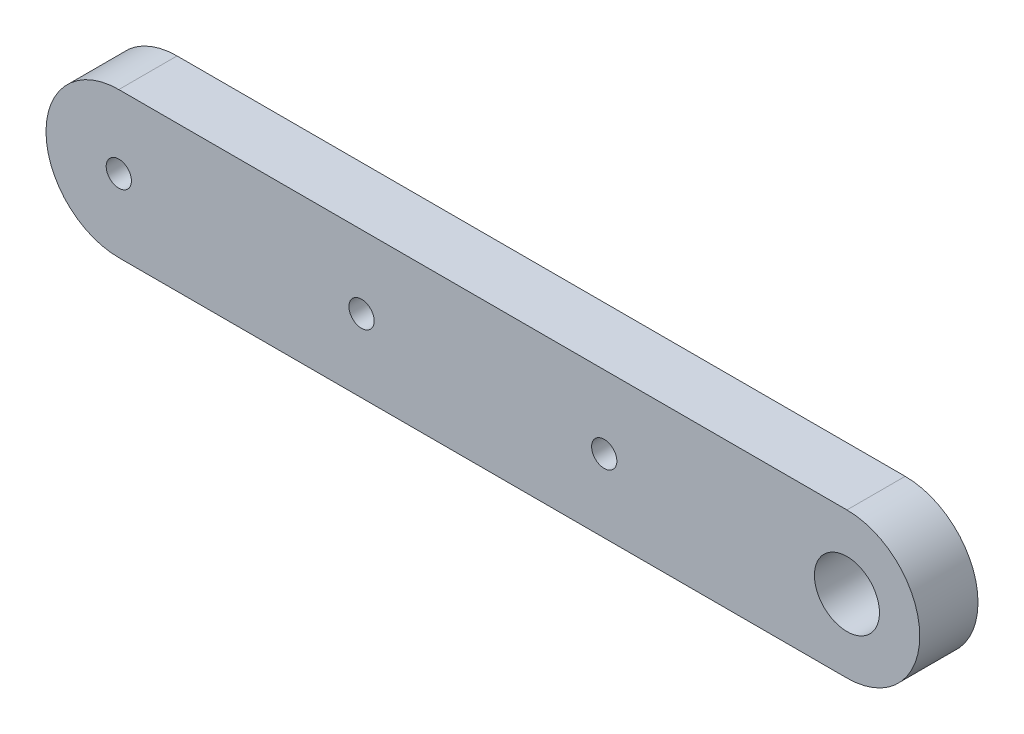
ISO-10303-21;
HEADER;
FILE_DESCRIPTION(('STEP AP214'),'2;1');
FILE_NAME('part.step','',(''),(''),'','','');
FILE_SCHEMA(('AUTOMOTIVE_DESIGN { 1 0 10303 214 1 1 1 1 }'));
ENDSEC;
DATA;
#1=APPLICATION_CONTEXT('core data for automotive mechanical design processes');
#2=APPLICATION_PROTOCOL_DEFINITION('international standard','automotive_design',2000,#1);
#3=PRODUCT_CONTEXT('',#1,'mechanical');
#4=PRODUCT('Part','Part','',(#3));
#5=PRODUCT_RELATED_PRODUCT_CATEGORY('part','',(#4));
#6=PRODUCT_DEFINITION_FORMATION('','',#4);
#7=PRODUCT_DEFINITION_CONTEXT('part definition',#1,'design');
#8=PRODUCT_DEFINITION('design','',#6,#7);
#9=PRODUCT_DEFINITION_SHAPE('','',#8);
#10=(LENGTH_UNIT() NAMED_UNIT(*) SI_UNIT(.MILLI.,.METRE.));
#11=(NAMED_UNIT(*) PLANE_ANGLE_UNIT() SI_UNIT($,.RADIAN.));
#12=(NAMED_UNIT(*) SI_UNIT($,.STERADIAN.) SOLID_ANGLE_UNIT());
#13=UNCERTAINTY_MEASURE_WITH_UNIT(LENGTH_MEASURE(1.E-05),#10,'distance_accuracy_value','');
#14=(GEOMETRIC_REPRESENTATION_CONTEXT(3) GLOBAL_UNCERTAINTY_ASSIGNED_CONTEXT((#13)) GLOBAL_UNIT_ASSIGNED_CONTEXT((#10,
#11,#12)) REPRESENTATION_CONTEXT('',''));
#15=CARTESIAN_POINT('',(0.,0.,0.));
#16=DIRECTION('',(0.,0.,1.));
#17=DIRECTION('',(1.,0.,0.));
#18=AXIS2_PLACEMENT_3D('',#15,#16,#17);
#19=CARTESIAN_POINT('',(0.,-7.5,6.));
#20=DIRECTION('',(0.,-1.,0.));
#21=DIRECTION('',(0.,0.,-1.));
#22=AXIS2_PLACEMENT_3D('',#19,#20,#21);
#23=PLANE('',#22);
#24=DIRECTION('',(-1.,0.,0.));
#25=VECTOR('',#24,1.);
#26=CARTESIAN_POINT('',(0.,-7.5,0.));
#27=LINE('',#26,#25);
#28=CARTESIAN_POINT('',(75.,-7.50000000000001,0.));
#29=VERTEX_POINT('',#28);
#30=CARTESIAN_POINT('',(0.,-7.5,0.));
#31=VERTEX_POINT('',#30);
#32=EDGE_CURVE('E111',#29,#31,#27,.T.);
#33=ORIENTED_EDGE('',*,*,#32,.F.);
#34=DIRECTION('',(0.,0.,-1.));
#35=VECTOR('',#34,1.);
#36=CARTESIAN_POINT('',(75.,-7.50000000000001,6.));
#37=LINE('',#36,#35);
#38=CARTESIAN_POINT('',(75.,-7.50000000000001,6.));
#39=VERTEX_POINT('',#38);
#40=EDGE_CURVE('E11',#39,#29,#37,.T.);
#41=ORIENTED_EDGE('',*,*,#40,.F.);
#42=DIRECTION('',(-1.,0.,0.));
#43=VECTOR('',#42,1.);
#44=CARTESIAN_POINT('',(0.,-7.5,6.));
#45=LINE('',#44,#43);
#46=CARTESIAN_POINT('',(0.,-7.5,6.));
#47=VERTEX_POINT('',#46);
#48=EDGE_CURVE('E92',#39,#47,#45,.T.);
#49=ORIENTED_EDGE('',*,*,#48,.T.);
#50=DIRECTION('',(0.,0.,-1.));
#51=VECTOR('',#50,1.);
#52=CARTESIAN_POINT('',(0.,-7.5,6.));
#53=LINE('',#52,#51);
#54=EDGE_CURVE('E82',#47,#31,#53,.T.);
#55=ORIENTED_EDGE('',*,*,#54,.T.);
#56=EDGE_LOOP('',(#33,#41,#49,#55));
#57=FACE_BOUND('',#56,.T.);
#58=ADVANCED_FACE('F43',(#57),#23,.T.);
#59=CARTESIAN_POINT('',(75.,0.,6.));
#60=DIRECTION('',(0.,0.,-1.));
#61=DIRECTION('',(-1.,0.,0.));
#62=AXIS2_PLACEMENT_3D('',#59,#60,#61);
#63=CYLINDRICAL_SURFACE('',#62,7.50000000000001);
#64=CARTESIAN_POINT('',(75.,0.,0.));
#65=DIRECTION('',(0.,0.,1.));
#66=DIRECTION('',(1.,0.,0.));
#67=AXIS2_PLACEMENT_3D('',#64,#65,#66);
#68=CIRCLE('',#67,7.50000000000001);
#69=CARTESIAN_POINT('',(75.,7.50000000000001,0.));
#70=VERTEX_POINT('',#69);
#71=EDGE_CURVE('E99',#29,#70,#68,.T.);
#72=ORIENTED_EDGE('',*,*,#71,.T.);
#73=DIRECTION('',(0.,0.,-1.));
#74=VECTOR('',#73,1.);
#75=CARTESIAN_POINT('',(75.,7.50000000000001,6.));
#76=LINE('',#75,#74);
#77=CARTESIAN_POINT('',(75.,7.50000000000001,6.));
#78=VERTEX_POINT('',#77);
#79=EDGE_CURVE('E52',#78,#70,#76,.T.);
#80=ORIENTED_EDGE('',*,*,#79,.F.);
#81=CARTESIAN_POINT('',(75.,0.,6.));
#82=DIRECTION('',(0.,0.,1.));
#83=DIRECTION('',(1.,0.,0.));
#84=AXIS2_PLACEMENT_3D('',#81,#82,#83);
#85=CIRCLE('',#84,7.50000000000001);
#86=EDGE_CURVE('E87',#39,#78,#85,.T.);
#87=ORIENTED_EDGE('',*,*,#86,.F.);
#88=ORIENTED_EDGE('',*,*,#40,.T.);
#89=EDGE_LOOP('',(#72,#80,#87,#88));
#90=FACE_BOUND('',#89,.T.);
#91=ADVANCED_FACE('F97',(#90),#63,.T.);
#92=CARTESIAN_POINT('',(0.,7.5,6.));
#93=DIRECTION('',(0.,1.,0.));
#94=DIRECTION('',(0.,0.,1.));
#95=AXIS2_PLACEMENT_3D('',#92,#93,#94);
#96=PLANE('',#95);
#97=DIRECTION('',(1.,0.,0.));
#98=VECTOR('',#97,1.);
#99=CARTESIAN_POINT('',(0.,7.5,0.));
#100=LINE('',#99,#98);
#101=CARTESIAN_POINT('',(0.,7.5,0.));
#102=VERTEX_POINT('',#101);
#103=EDGE_CURVE('E118',#102,#70,#100,.T.);
#104=ORIENTED_EDGE('',*,*,#103,.F.);
#105=DIRECTION('',(0.,0.,-1.));
#106=VECTOR('',#105,1.);
#107=CARTESIAN_POINT('',(0.,7.5,6.));
#108=LINE('',#107,#106);
#109=CARTESIAN_POINT('',(0.,7.5,6.));
#110=VERTEX_POINT('',#109);
#111=EDGE_CURVE('E75',#110,#102,#108,.T.);
#112=ORIENTED_EDGE('',*,*,#111,.F.);
#113=DIRECTION('',(1.,0.,0.));
#114=VECTOR('',#113,1.);
#115=CARTESIAN_POINT('',(0.,7.5,6.));
#116=LINE('',#115,#114);
#117=EDGE_CURVE('E91',#110,#78,#116,.T.);
#118=ORIENTED_EDGE('',*,*,#117,.T.);
#119=ORIENTED_EDGE('',*,*,#79,.T.);
#120=EDGE_LOOP('',(#104,#112,#118,#119));
#121=FACE_BOUND('',#120,.T.);
#122=ADVANCED_FACE('F104',(#121),#96,.T.);
#123=CARTESIAN_POINT('',(0.,0.,6.));
#124=DIRECTION('',(0.,0.,-1.));
#125=DIRECTION('',(-1.,0.,0.));
#126=AXIS2_PLACEMENT_3D('',#123,#124,#125);
#127=CYLINDRICAL_SURFACE('',#126,7.5);
#128=CARTESIAN_POINT('',(0.,0.,0.));
#129=DIRECTION('',(0.,0.,1.));
#130=DIRECTION('',(1.,0.,0.));
#131=AXIS2_PLACEMENT_3D('',#128,#129,#130);
#132=CIRCLE('',#131,7.5);
#133=EDGE_CURVE('E121',#102,#31,#132,.T.);
#134=ORIENTED_EDGE('',*,*,#133,.T.);
#135=ORIENTED_EDGE('',*,*,#54,.F.);
#136=CARTESIAN_POINT('',(0.,0.,6.));
#137=DIRECTION('',(0.,0.,1.));
#138=DIRECTION('',(1.,0.,0.));
#139=AXIS2_PLACEMENT_3D('',#136,#137,#138);
#140=CIRCLE('',#139,7.5);
#141=EDGE_CURVE('E60',#110,#47,#140,.T.);
#142=ORIENTED_EDGE('',*,*,#141,.F.);
#143=ORIENTED_EDGE('',*,*,#111,.T.);
#144=EDGE_LOOP('',(#134,#135,#142,#143));
#145=FACE_BOUND('',#144,.T.);
#146=ADVANCED_FACE('F173',(#145),#127,.T.);
#147=CARTESIAN_POINT('',(0.,0.,6.));
#148=DIRECTION('',(0.,0.,1.));
#149=DIRECTION('',(1.,0.,0.));
#150=AXIS2_PLACEMENT_3D('',#147,#148,#149);
#151=PLANE('',#150);
#152=CARTESIAN_POINT('',(75.,0.,6.));
#153=DIRECTION('',(0.,0.,1.));
#154=DIRECTION('',(1.,0.,0.));
#155=AXIS2_PLACEMENT_3D('',#152,#153,#154);
#156=CIRCLE('',#155,3.35);
#157=CARTESIAN_POINT('',(78.35,0.,6.));
#158=VERTEX_POINT('',#157);
#159=EDGE_CURVE('E153',#158,#158,#156,.T.);
#160=ORIENTED_EDGE('',*,*,#159,.F.);
#161=EDGE_LOOP('',(#160));
#162=FACE_BOUND('',#161,.T.);
#163=CARTESIAN_POINT('',(25.,0.,6.));
#164=DIRECTION('',(0.,0.,1.));
#165=DIRECTION('',(1.,0.,0.));
#166=AXIS2_PLACEMENT_3D('',#163,#164,#165);
#167=CIRCLE('',#166,1.3);
#168=CARTESIAN_POINT('',(26.3,0.,6.));
#169=VERTEX_POINT('',#168);
#170=EDGE_CURVE('E146',#169,#169,#167,.T.);
#171=ORIENTED_EDGE('',*,*,#170,.F.);
#172=EDGE_LOOP('',(#171));
#173=FACE_BOUND('',#172,.T.);
#174=CARTESIAN_POINT('',(50.,0.,6.));
#175=DIRECTION('',(0.,0.,1.));
#176=DIRECTION('',(1.,0.,0.));
#177=AXIS2_PLACEMENT_3D('',#174,#175,#176);
#178=CIRCLE('',#177,1.3);
#179=CARTESIAN_POINT('',(51.3,0.,6.));
#180=VERTEX_POINT('',#179);
#181=EDGE_CURVE('E137',#180,#180,#178,.T.);
#182=ORIENTED_EDGE('',*,*,#181,.F.);
#183=EDGE_LOOP('',(#182));
#184=FACE_BOUND('',#183,.T.);
#185=CARTESIAN_POINT('',(0.,0.,6.));
#186=DIRECTION('',(0.,0.,1.));
#187=DIRECTION('',(1.,0.,0.));
#188=AXIS2_PLACEMENT_3D('',#185,#186,#187);
#189=CIRCLE('',#188,1.3);
#190=CARTESIAN_POINT('',(1.3,0.,6.));
#191=VERTEX_POINT('',#190);
#192=EDGE_CURVE('E129',#191,#191,#189,.T.);
#193=ORIENTED_EDGE('',*,*,#192,.F.);
#194=EDGE_LOOP('',(#193));
#195=FACE_BOUND('',#194,.T.);
#196=ORIENTED_EDGE('',*,*,#48,.F.);
#197=ORIENTED_EDGE('',*,*,#86,.T.);
#198=ORIENTED_EDGE('',*,*,#117,.F.);
#199=ORIENTED_EDGE('',*,*,#141,.T.);
#200=EDGE_LOOP('',(#196,#197,#198,#199));
#201=FACE_BOUND('',#200,.T.);
#202=ADVANCED_FACE('F89',(#162,#173,#184,#195,#201),#151,.T.);
#203=CARTESIAN_POINT('',(0.,0.,0.));
#204=DIRECTION('',(0.,0.,1.));
#205=DIRECTION('',(1.,0.,0.));
#206=AXIS2_PLACEMENT_3D('',#203,#204,#205);
#207=PLANE('',#206);
#208=CARTESIAN_POINT('',(75.,0.,0.));
#209=DIRECTION('',(0.,0.,1.));
#210=DIRECTION('',(1.,0.,0.));
#211=AXIS2_PLACEMENT_3D('',#208,#209,#210);
#212=CIRCLE('',#211,3.35);
#213=CARTESIAN_POINT('',(78.35,0.,0.));
#214=VERTEX_POINT('',#213);
#215=EDGE_CURVE('E142',#214,#214,#212,.T.);
#216=ORIENTED_EDGE('',*,*,#215,.T.);
#217=EDGE_LOOP('',(#216));
#218=FACE_BOUND('',#217,.T.);
#219=CARTESIAN_POINT('',(25.,0.,0.));
#220=DIRECTION('',(0.,0.,1.));
#221=DIRECTION('',(1.,0.,0.));
#222=AXIS2_PLACEMENT_3D('',#219,#220,#221);
#223=CIRCLE('',#222,1.3);
#224=CARTESIAN_POINT('',(26.3,0.,0.));
#225=VERTEX_POINT('',#224);
#226=EDGE_CURVE('E133',#225,#225,#223,.T.);
#227=ORIENTED_EDGE('',*,*,#226,.T.);
#228=EDGE_LOOP('',(#227));
#229=FACE_BOUND('',#228,.T.);
#230=CARTESIAN_POINT('',(50.,0.,0.));
#231=DIRECTION('',(0.,0.,1.));
#232=DIRECTION('',(1.,0.,0.));
#233=AXIS2_PLACEMENT_3D('',#230,#231,#232);
#234=CIRCLE('',#233,1.3);
#235=CARTESIAN_POINT('',(51.3,0.,0.));
#236=VERTEX_POINT('',#235);
#237=EDGE_CURVE('E141',#236,#236,#234,.T.);
#238=ORIENTED_EDGE('',*,*,#237,.T.);
#239=EDGE_LOOP('',(#238));
#240=FACE_BOUND('',#239,.T.);
#241=CARTESIAN_POINT('',(0.,0.,0.));
#242=DIRECTION('',(0.,0.,1.));
#243=DIRECTION('',(1.,0.,0.));
#244=AXIS2_PLACEMENT_3D('',#241,#242,#243);
#245=CIRCLE('',#244,1.3);
#246=CARTESIAN_POINT('',(1.3,0.,0.));
#247=VERTEX_POINT('',#246);
#248=EDGE_CURVE('E115',#247,#247,#245,.T.);
#249=ORIENTED_EDGE('',*,*,#248,.T.);
#250=EDGE_LOOP('',(#249));
#251=FACE_BOUND('',#250,.T.);
#252=ORIENTED_EDGE('',*,*,#32,.T.);
#253=ORIENTED_EDGE('',*,*,#133,.F.);
#254=ORIENTED_EDGE('',*,*,#103,.T.);
#255=ORIENTED_EDGE('',*,*,#71,.F.);
#256=EDGE_LOOP('',(#252,#253,#254,#255));
#257=FACE_BOUND('',#256,.T.);
#258=ADVANCED_FACE('F161',(#218,#229,#240,#251,#257),#207,.F.);
#259=CARTESIAN_POINT('',(0.,0.,0.));
#260=DIRECTION('',(0.,0.,1.));
#261=DIRECTION('',(1.,0.,0.));
#262=AXIS2_PLACEMENT_3D('',#259,#260,#261);
#263=CYLINDRICAL_SURFACE('',#262,1.3);
#264=ORIENTED_EDGE('',*,*,#248,.F.);
#265=EDGE_LOOP('',(#264));
#266=FACE_BOUND('',#265,.T.);
#267=ORIENTED_EDGE('',*,*,#192,.T.);
#268=EDGE_LOOP('',(#267));
#269=FACE_BOUND('',#268,.T.);
#270=ADVANCED_FACE('F181',(#266,#269),#263,.F.);
#271=CARTESIAN_POINT('',(50.,0.,0.));
#272=DIRECTION('',(0.,0.,1.));
#273=DIRECTION('',(1.,0.,0.));
#274=AXIS2_PLACEMENT_3D('',#271,#272,#273);
#275=CYLINDRICAL_SURFACE('',#274,1.3);
#276=ORIENTED_EDGE('',*,*,#237,.F.);
#277=EDGE_LOOP('',(#276));
#278=FACE_BOUND('',#277,.T.);
#279=ORIENTED_EDGE('',*,*,#181,.T.);
#280=EDGE_LOOP('',(#279));
#281=FACE_BOUND('',#280,.T.);
#282=ADVANCED_FACE('F183',(#278,#281),#275,.F.);
#283=CARTESIAN_POINT('',(25.,0.,0.));
#284=DIRECTION('',(0.,0.,1.));
#285=DIRECTION('',(1.,0.,0.));
#286=AXIS2_PLACEMENT_3D('',#283,#284,#285);
#287=CYLINDRICAL_SURFACE('',#286,1.3);
#288=ORIENTED_EDGE('',*,*,#226,.F.);
#289=EDGE_LOOP('',(#288));
#290=FACE_BOUND('',#289,.T.);
#291=ORIENTED_EDGE('',*,*,#170,.T.);
#292=EDGE_LOOP('',(#291));
#293=FACE_BOUND('',#292,.T.);
#294=ADVANCED_FACE('F167',(#290,#293),#287,.F.);
#295=CARTESIAN_POINT('',(75.,0.,0.));
#296=DIRECTION('',(0.,0.,1.));
#297=DIRECTION('',(1.,0.,0.));
#298=AXIS2_PLACEMENT_3D('',#295,#296,#297);
#299=CYLINDRICAL_SURFACE('',#298,3.35);
#300=ORIENTED_EDGE('',*,*,#215,.F.);
#301=EDGE_LOOP('',(#300));
#302=FACE_BOUND('',#301,.T.);
#303=ORIENTED_EDGE('',*,*,#159,.T.);
#304=EDGE_LOOP('',(#303));
#305=FACE_BOUND('',#304,.T.);
#306=ADVANCED_FACE('F164',(#302,#305),#299,.F.);
#307=CLOSED_SHELL('',(#58,#91,#122,#146,#202,#258,#270,#282,#294,#306));
#308=MANIFOLD_SOLID_BREP('B2',#307);
#309=ADVANCED_BREP_SHAPE_REPRESENTATION('',(#18,#308),#14);
#310=SHAPE_DEFINITION_REPRESENTATION(#9,#309);
ENDSEC;
END-ISO-10303-21;
